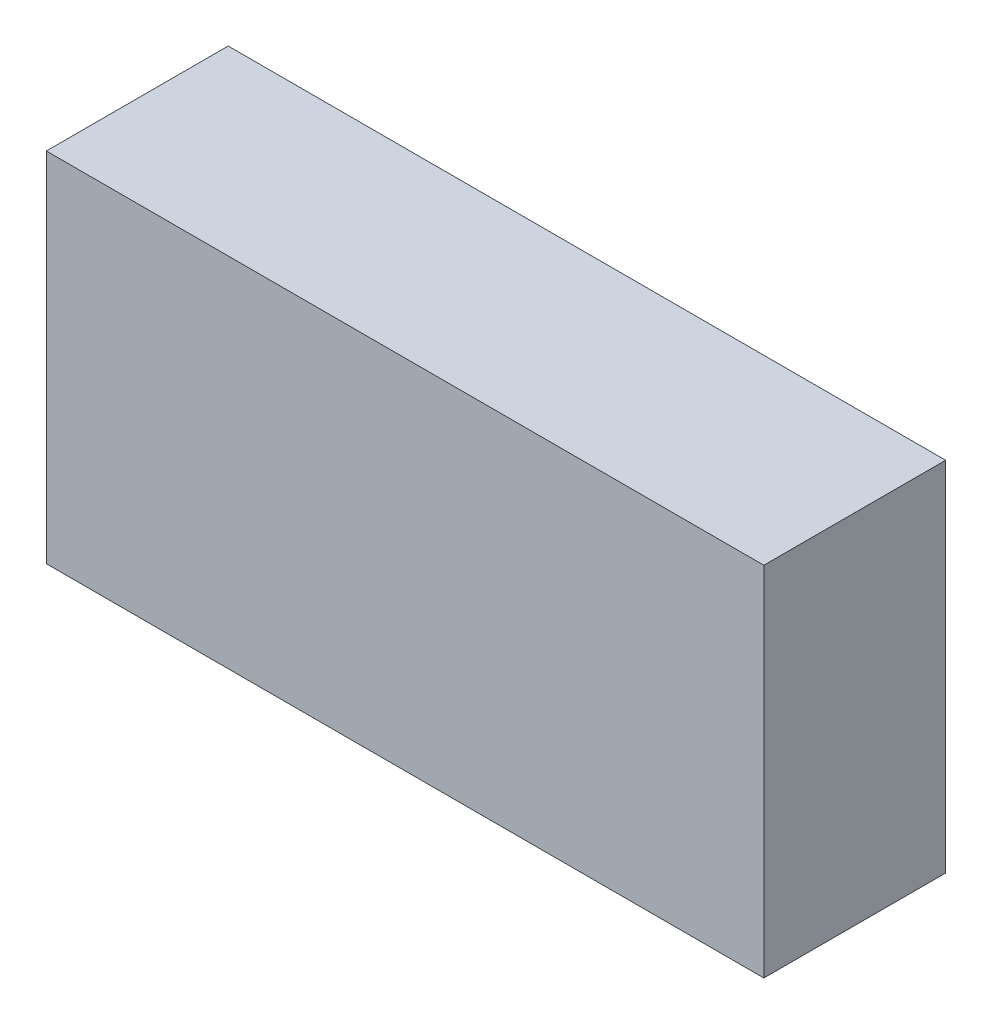
ISO-10303-21;
HEADER;
FILE_DESCRIPTION(('STEP AP214'),'2;1');
FILE_NAME('part.step','',(''),(''),'','','');
FILE_SCHEMA(('AUTOMOTIVE_DESIGN { 1 0 10303 214 1 1 1 1 }'));
ENDSEC;
DATA;
#1=APPLICATION_CONTEXT('core data for automotive mechanical design processes');
#2=APPLICATION_PROTOCOL_DEFINITION('international standard','automotive_design',2000,#1);
#3=PRODUCT_CONTEXT('',#1,'mechanical');
#4=PRODUCT('Part','Part','',(#3));
#5=PRODUCT_RELATED_PRODUCT_CATEGORY('part','',(#4));
#6=PRODUCT_DEFINITION_FORMATION('','',#4);
#7=PRODUCT_DEFINITION_CONTEXT('part definition',#1,'design');
#8=PRODUCT_DEFINITION('design','',#6,#7);
#9=PRODUCT_DEFINITION_SHAPE('','',#8);
#10=(LENGTH_UNIT() NAMED_UNIT(*) SI_UNIT(.MILLI.,.METRE.));
#11=(NAMED_UNIT(*) PLANE_ANGLE_UNIT() SI_UNIT($,.RADIAN.));
#12=(NAMED_UNIT(*) SI_UNIT($,.STERADIAN.) SOLID_ANGLE_UNIT());
#13=UNCERTAINTY_MEASURE_WITH_UNIT(LENGTH_MEASURE(1.E-05),#10,'distance_accuracy_value','');
#14=(GEOMETRIC_REPRESENTATION_CONTEXT(3) GLOBAL_UNCERTAINTY_ASSIGNED_CONTEXT((#13)) GLOBAL_UNIT_ASSIGNED_CONTEXT((#10,
#11,#12)) REPRESENTATION_CONTEXT('',''));
#15=CARTESIAN_POINT('',(0.,0.,0.));
#16=DIRECTION('',(0.,0.,1.));
#17=DIRECTION('',(1.,0.,0.));
#18=AXIS2_PLACEMENT_3D('',#15,#16,#17);
#19=CARTESIAN_POINT('',(-1.973,-0.983,1.));
#20=DIRECTION('',(1.,0.,0.));
#21=DIRECTION('',(0.,0.,-1.));
#22=AXIS2_PLACEMENT_3D('',#19,#20,#21);
#23=PLANE('',#22);
#24=DIRECTION('',(0.,-1.,0.));
#25=VECTOR('',#24,1.);
#26=CARTESIAN_POINT('',(-1.973,-0.983,0.));
#27=LINE('',#26,#25);
#28=CARTESIAN_POINT('',(-1.973,0.983,0.));
#29=VERTEX_POINT('',#28);
#30=CARTESIAN_POINT('',(-1.973,-0.983,0.));
#31=VERTEX_POINT('',#30);
#32=EDGE_CURVE('E95',#29,#31,#27,.T.);
#33=ORIENTED_EDGE('',*,*,#32,.T.);
#34=DIRECTION('',(0.,0.,-1.));
#35=VECTOR('',#34,1.);
#36=CARTESIAN_POINT('',(-1.973,-0.983,1.));
#37=LINE('',#36,#35);
#38=CARTESIAN_POINT('',(-1.973,-0.983,1.));
#39=VERTEX_POINT('',#38);
#40=EDGE_CURVE('E11',#39,#31,#37,.T.);
#41=ORIENTED_EDGE('',*,*,#40,.F.);
#42=DIRECTION('',(0.,-1.,0.));
#43=VECTOR('',#42,1.);
#44=CARTESIAN_POINT('',(-1.973,-0.983,1.));
#45=LINE('',#44,#43);
#46=CARTESIAN_POINT('',(-1.973,0.983,1.));
#47=VERTEX_POINT('',#46);
#48=EDGE_CURVE('E83',#47,#39,#45,.T.);
#49=ORIENTED_EDGE('',*,*,#48,.F.);
#50=DIRECTION('',(0.,0.,-1.));
#51=VECTOR('',#50,1.);
#52=CARTESIAN_POINT('',(-1.973,0.983,1.));
#53=LINE('',#52,#51);
#54=EDGE_CURVE('E91',#47,#29,#53,.T.);
#55=ORIENTED_EDGE('',*,*,#54,.T.);
#56=EDGE_LOOP('',(#33,#41,#49,#55));
#57=FACE_BOUND('',#56,.T.);
#58=ADVANCED_FACE('F32',(#57),#23,.F.);
#59=CARTESIAN_POINT('',(1.973,-0.983,1.));
#60=DIRECTION('',(0.,1.,0.));
#61=DIRECTION('',(0.,0.,1.));
#62=AXIS2_PLACEMENT_3D('',#59,#60,#61);
#63=PLANE('',#62);
#64=DIRECTION('',(1.,0.,0.));
#65=VECTOR('',#64,1.);
#66=CARTESIAN_POINT('',(1.973,-0.983,0.));
#67=LINE('',#66,#65);
#68=CARTESIAN_POINT('',(1.973,-0.983,0.));
#69=VERTEX_POINT('',#68);
#70=EDGE_CURVE('E87',#31,#69,#67,.T.);
#71=ORIENTED_EDGE('',*,*,#70,.T.);
#72=DIRECTION('',(0.,0.,-1.));
#73=VECTOR('',#72,1.);
#74=CARTESIAN_POINT('',(1.973,-0.983,1.));
#75=LINE('',#74,#73);
#76=CARTESIAN_POINT('',(1.973,-0.983,1.));
#77=VERTEX_POINT('',#76);
#78=EDGE_CURVE('E40',#77,#69,#75,.T.);
#79=ORIENTED_EDGE('',*,*,#78,.F.);
#80=DIRECTION('',(1.,0.,0.));
#81=VECTOR('',#80,1.);
#82=CARTESIAN_POINT('',(1.973,-0.983,1.));
#83=LINE('',#82,#81);
#84=EDGE_CURVE('E78',#39,#77,#83,.T.);
#85=ORIENTED_EDGE('',*,*,#84,.F.);
#86=ORIENTED_EDGE('',*,*,#40,.T.);
#87=EDGE_LOOP('',(#71,#79,#85,#86));
#88=FACE_BOUND('',#87,.T.);
#89=ADVANCED_FACE('F86',(#88),#63,.F.);
#90=CARTESIAN_POINT('',(1.973,0.983,1.));
#91=DIRECTION('',(-1.,0.,0.));
#92=DIRECTION('',(0.,0.,1.));
#93=AXIS2_PLACEMENT_3D('',#90,#91,#92);
#94=PLANE('',#93);
#95=DIRECTION('',(0.,1.,0.));
#96=VECTOR('',#95,1.);
#97=CARTESIAN_POINT('',(1.973,0.983,0.));
#98=LINE('',#97,#96);
#99=CARTESIAN_POINT('',(1.973,0.983,0.));
#100=VERTEX_POINT('',#99);
#101=EDGE_CURVE('E65',#69,#100,#98,.T.);
#102=ORIENTED_EDGE('',*,*,#101,.T.);
#103=DIRECTION('',(0.,0.,-1.));
#104=VECTOR('',#103,1.);
#105=CARTESIAN_POINT('',(1.973,0.983,1.));
#106=LINE('',#105,#104);
#107=CARTESIAN_POINT('',(1.973,0.983,1.));
#108=VERTEX_POINT('',#107);
#109=EDGE_CURVE('E88',#108,#100,#106,.T.);
#110=ORIENTED_EDGE('',*,*,#109,.F.);
#111=DIRECTION('',(0.,1.,0.));
#112=VECTOR('',#111,1.);
#113=CARTESIAN_POINT('',(1.973,0.983,1.));
#114=LINE('',#113,#112);
#115=EDGE_CURVE('E81',#77,#108,#114,.T.);
#116=ORIENTED_EDGE('',*,*,#115,.F.);
#117=ORIENTED_EDGE('',*,*,#78,.T.);
#118=EDGE_LOOP('',(#102,#110,#116,#117));
#119=FACE_BOUND('',#118,.T.);
#120=ADVANCED_FACE('F89',(#119),#94,.F.);
#121=CARTESIAN_POINT('',(-1.973,0.983,1.));
#122=DIRECTION('',(0.,-1.,0.));
#123=DIRECTION('',(0.,0.,-1.));
#124=AXIS2_PLACEMENT_3D('',#121,#122,#123);
#125=PLANE('',#124);
#126=DIRECTION('',(-1.,0.,0.));
#127=VECTOR('',#126,1.);
#128=CARTESIAN_POINT('',(-1.973,0.983,0.));
#129=LINE('',#128,#127);
#130=EDGE_CURVE('E71',#100,#29,#129,.T.);
#131=ORIENTED_EDGE('',*,*,#130,.T.);
#132=ORIENTED_EDGE('',*,*,#54,.F.);
#133=DIRECTION('',(-1.,0.,0.));
#134=VECTOR('',#133,1.);
#135=CARTESIAN_POINT('',(-1.973,0.983,1.));
#136=LINE('',#135,#134);
#137=EDGE_CURVE('E48',#108,#47,#136,.T.);
#138=ORIENTED_EDGE('',*,*,#137,.F.);
#139=ORIENTED_EDGE('',*,*,#109,.T.);
#140=EDGE_LOOP('',(#131,#132,#138,#139));
#141=FACE_BOUND('',#140,.T.);
#142=ADVANCED_FACE('F102',(#141),#125,.F.);
#143=CARTESIAN_POINT('',(0.,0.,1.));
#144=DIRECTION('',(0.,0.,-1.));
#145=DIRECTION('',(-1.,0.,0.));
#146=AXIS2_PLACEMENT_3D('',#143,#144,#145);
#147=PLANE('',#146);
#148=ORIENTED_EDGE('',*,*,#48,.T.);
#149=ORIENTED_EDGE('',*,*,#84,.T.);
#150=ORIENTED_EDGE('',*,*,#115,.T.);
#151=ORIENTED_EDGE('',*,*,#137,.T.);
#152=EDGE_LOOP('',(#148,#149,#150,#151));
#153=FACE_BOUND('',#152,.T.);
#154=ADVANCED_FACE('F79',(#153),#147,.F.);
#155=CARTESIAN_POINT('',(0.,0.,0.));
#156=DIRECTION('',(0.,0.,-1.));
#157=DIRECTION('',(-1.,0.,0.));
#158=AXIS2_PLACEMENT_3D('',#155,#156,#157);
#159=PLANE('',#158);
#160=ORIENTED_EDGE('',*,*,#32,.F.);
#161=ORIENTED_EDGE('',*,*,#130,.F.);
#162=ORIENTED_EDGE('',*,*,#101,.F.);
#163=ORIENTED_EDGE('',*,*,#70,.F.);
#164=EDGE_LOOP('',(#160,#161,#162,#163));
#165=FACE_BOUND('',#164,.T.);
#166=ADVANCED_FACE('F105',(#165),#159,.T.);
#167=CLOSED_SHELL('',(#58,#89,#120,#142,#154,#166));
#168=MANIFOLD_SOLID_BREP('B2',#167);
#169=ADVANCED_BREP_SHAPE_REPRESENTATION('',(#18,#168),#14);
#170=SHAPE_DEFINITION_REPRESENTATION(#9,#169);
ENDSEC;
END-ISO-10303-21;
